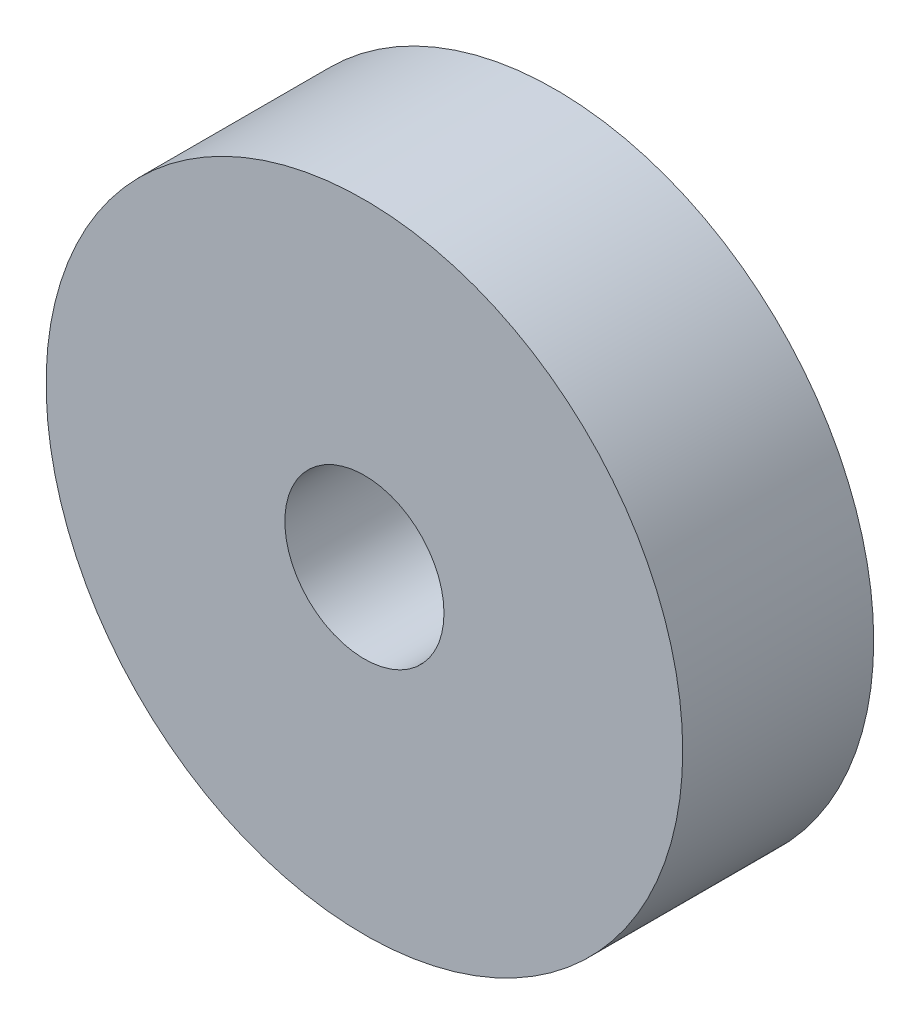
ISO-10303-21;
HEADER;
FILE_DESCRIPTION(('STEP AP214'),'2;1');
FILE_NAME('part.step','',(''),(''),'','','');
FILE_SCHEMA(('AUTOMOTIVE_DESIGN { 1 0 10303 214 1 1 1 1 }'));
ENDSEC;
DATA;
#1=APPLICATION_CONTEXT('core data for automotive mechanical design processes');
#2=APPLICATION_PROTOCOL_DEFINITION('international standard','automotive_design',2000,#1);
#3=PRODUCT_CONTEXT('',#1,'mechanical');
#4=PRODUCT('Part','Part','',(#3));
#5=PRODUCT_RELATED_PRODUCT_CATEGORY('part','',(#4));
#6=PRODUCT_DEFINITION_FORMATION('','',#4);
#7=PRODUCT_DEFINITION_CONTEXT('part definition',#1,'design');
#8=PRODUCT_DEFINITION('design','',#6,#7);
#9=PRODUCT_DEFINITION_SHAPE('','',#8);
#10=(LENGTH_UNIT() NAMED_UNIT(*) SI_UNIT(.MILLI.,.METRE.));
#11=(NAMED_UNIT(*) PLANE_ANGLE_UNIT() SI_UNIT($,.RADIAN.));
#12=(NAMED_UNIT(*) SI_UNIT($,.STERADIAN.) SOLID_ANGLE_UNIT());
#13=UNCERTAINTY_MEASURE_WITH_UNIT(LENGTH_MEASURE(1.E-05),#10,'distance_accuracy_value','');
#14=(GEOMETRIC_REPRESENTATION_CONTEXT(3) GLOBAL_UNCERTAINTY_ASSIGNED_CONTEXT((#13)) GLOBAL_UNIT_ASSIGNED_CONTEXT((#10,
#11,#12)) REPRESENTATION_CONTEXT('',''));
#15=CARTESIAN_POINT('',(0.,0.,0.));
#16=DIRECTION('',(0.,0.,1.));
#17=DIRECTION('',(1.,0.,0.));
#18=AXIS2_PLACEMENT_3D('',#15,#16,#17);
#19=CARTESIAN_POINT('',(0.,0.,6.));
#20=DIRECTION('',(0.,0.,1.));
#21=DIRECTION('',(1.,0.,0.));
#22=AXIS2_PLACEMENT_3D('',#19,#20,#21);
#23=PLANE('',#22);
#24=CARTESIAN_POINT('',(0.,0.,6.));
#25=DIRECTION('',(0.,0.,1.));
#26=DIRECTION('',(1.,0.,0.));
#27=AXIS2_PLACEMENT_3D('',#24,#25,#26);
#28=CIRCLE('',#27,10.);
#29=CARTESIAN_POINT('',(10.,0.,6.));
#30=VERTEX_POINT('',#29);
#31=EDGE_CURVE('E10',#30,#30,#28,.T.);
#32=ORIENTED_EDGE('',*,*,#31,.T.);
#33=EDGE_LOOP('',(#32));
#34=FACE_BOUND('',#33,.T.);
#35=CARTESIAN_POINT('',(0.,0.,6.));
#36=DIRECTION('',(0.,0.,1.));
#37=DIRECTION('',(1.,0.,0.));
#38=AXIS2_PLACEMENT_3D('',#35,#36,#37);
#39=CIRCLE('',#38,2.5);
#40=CARTESIAN_POINT('',(2.5,0.,6.));
#41=VERTEX_POINT('',#40);
#42=EDGE_CURVE('E41',#41,#41,#39,.T.);
#43=ORIENTED_EDGE('',*,*,#42,.F.);
#44=EDGE_LOOP('',(#43));
#45=FACE_BOUND('',#44,.T.);
#46=ADVANCED_FACE('F30',(#34,#45),#23,.T.);
#47=CARTESIAN_POINT('',(0.,0.,0.));
#48=DIRECTION('',(0.,0.,1.));
#49=DIRECTION('',(1.,0.,0.));
#50=AXIS2_PLACEMENT_3D('',#47,#48,#49);
#51=PLANE('',#50);
#52=CARTESIAN_POINT('',(0.,0.,0.));
#53=DIRECTION('',(0.,0.,1.));
#54=DIRECTION('',(1.,0.,0.));
#55=AXIS2_PLACEMENT_3D('',#52,#53,#54);
#56=CIRCLE('',#55,10.);
#57=CARTESIAN_POINT('',(10.,0.,0.));
#58=VERTEX_POINT('',#57);
#59=EDGE_CURVE('E34',#58,#58,#56,.T.);
#60=ORIENTED_EDGE('',*,*,#59,.F.);
#61=EDGE_LOOP('',(#60));
#62=FACE_BOUND('',#61,.T.);
#63=CARTESIAN_POINT('',(0.,0.,0.));
#64=DIRECTION('',(0.,0.,1.));
#65=DIRECTION('',(1.,0.,0.));
#66=AXIS2_PLACEMENT_3D('',#63,#64,#65);
#67=CIRCLE('',#66,2.5);
#68=CARTESIAN_POINT('',(2.5,0.,0.));
#69=VERTEX_POINT('',#68);
#70=EDGE_CURVE('E43',#69,#69,#67,.T.);
#71=ORIENTED_EDGE('',*,*,#70,.T.);
#72=EDGE_LOOP('',(#71));
#73=FACE_BOUND('',#72,.T.);
#74=ADVANCED_FACE('F53',(#62,#73),#51,.F.);
#75=CARTESIAN_POINT('',(0.,0.,6.));
#76=DIRECTION('',(0.,0.,-1.));
#77=DIRECTION('',(-1.,0.,0.));
#78=AXIS2_PLACEMENT_3D('',#75,#76,#77);
#79=CYLINDRICAL_SURFACE('',#78,10.);
#80=ORIENTED_EDGE('',*,*,#31,.F.);
#81=EDGE_LOOP('',(#80));
#82=FACE_BOUND('',#81,.T.);
#83=ORIENTED_EDGE('',*,*,#59,.T.);
#84=EDGE_LOOP('',(#83));
#85=FACE_BOUND('',#84,.T.);
#86=ADVANCED_FACE('F32',(#82,#85),#79,.T.);
#87=CARTESIAN_POINT('',(0.,0.,6.));
#88=DIRECTION('',(0.,0.,-1.));
#89=DIRECTION('',(-1.,0.,0.));
#90=AXIS2_PLACEMENT_3D('',#87,#88,#89);
#91=CYLINDRICAL_SURFACE('',#90,2.5);
#92=ORIENTED_EDGE('',*,*,#42,.T.);
#93=EDGE_LOOP('',(#92));
#94=FACE_BOUND('',#93,.T.);
#95=ORIENTED_EDGE('',*,*,#70,.F.);
#96=EDGE_LOOP('',(#95));
#97=FACE_BOUND('',#96,.T.);
#98=ADVANCED_FACE('F49',(#94,#97),#91,.F.);
#99=CLOSED_SHELL('',(#46,#74,#86,#98));
#100=MANIFOLD_SOLID_BREP('B2',#99);
#101=ADVANCED_BREP_SHAPE_REPRESENTATION('',(#18,#100),#14);
#102=SHAPE_DEFINITION_REPRESENTATION(#9,#101);
ENDSEC;
END-ISO-10303-21;
